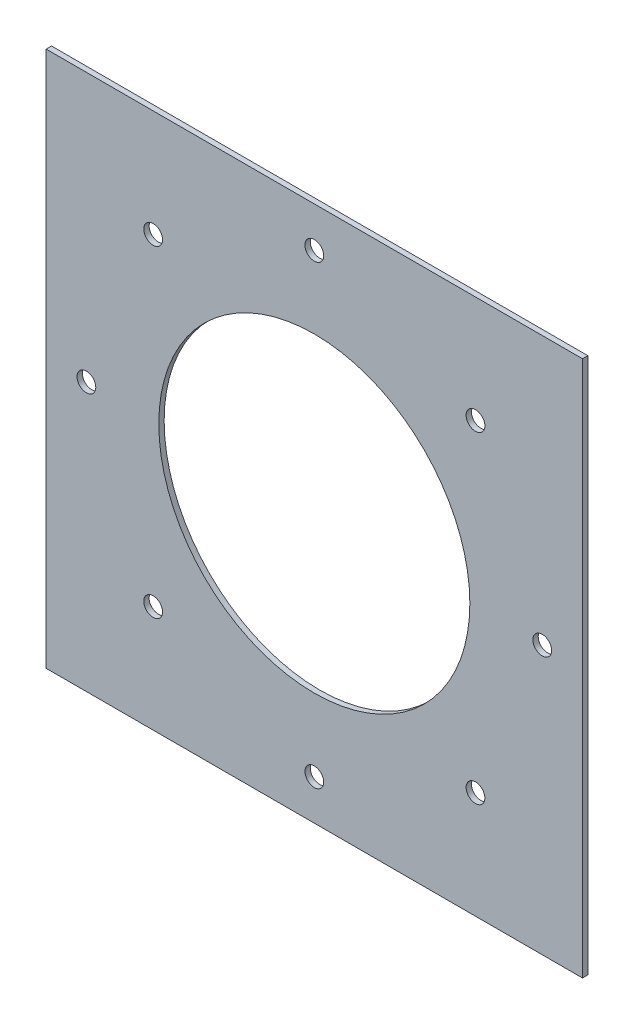
ISO-10303-21;
HEADER;
FILE_DESCRIPTION(('STEP AP214'),'2;1');
FILE_NAME('part.step','',(''),(''),'','','');
FILE_SCHEMA(('AUTOMOTIVE_DESIGN { 1 0 10303 214 1 1 1 1 }'));
ENDSEC;
DATA;
#1=APPLICATION_CONTEXT('core data for automotive mechanical design processes');
#2=APPLICATION_PROTOCOL_DEFINITION('international standard','automotive_design',2000,#1);
#3=PRODUCT_CONTEXT('',#1,'mechanical');
#4=PRODUCT('Part','Part','',(#3));
#5=PRODUCT_RELATED_PRODUCT_CATEGORY('part','',(#4));
#6=PRODUCT_DEFINITION_FORMATION('','',#4);
#7=PRODUCT_DEFINITION_CONTEXT('part definition',#1,'design');
#8=PRODUCT_DEFINITION('design','',#6,#7);
#9=PRODUCT_DEFINITION_SHAPE('','',#8);
#10=(LENGTH_UNIT() NAMED_UNIT(*) SI_UNIT(.MILLI.,.METRE.));
#11=(NAMED_UNIT(*) PLANE_ANGLE_UNIT() SI_UNIT($,.RADIAN.));
#12=(NAMED_UNIT(*) SI_UNIT($,.STERADIAN.) SOLID_ANGLE_UNIT());
#13=UNCERTAINTY_MEASURE_WITH_UNIT(LENGTH_MEASURE(1.E-05),#10,'distance_accuracy_value','');
#14=(GEOMETRIC_REPRESENTATION_CONTEXT(3) GLOBAL_UNCERTAINTY_ASSIGNED_CONTEXT((#13)) GLOBAL_UNIT_ASSIGNED_CONTEXT((#10,
#11,#12)) REPRESENTATION_CONTEXT('',''));
#15=CARTESIAN_POINT('',(0.,0.,0.));
#16=DIRECTION('',(0.,0.,1.));
#17=DIRECTION('',(1.,0.,0.));
#18=AXIS2_PLACEMENT_3D('',#15,#16,#17);
#19=CARTESIAN_POINT('',(50.,-50.,1.));
#20=DIRECTION('',(-1.,0.,0.));
#21=DIRECTION('',(0.,0.,1.));
#22=AXIS2_PLACEMENT_3D('',#19,#20,#21);
#23=PLANE('',#22);
#24=DIRECTION('',(0.,1.,0.));
#25=VECTOR('',#24,1.);
#26=CARTESIAN_POINT('',(50.,-50.,0.));
#27=LINE('',#26,#25);
#28=CARTESIAN_POINT('',(50.,-50.,0.));
#29=VERTEX_POINT('',#28);
#30=CARTESIAN_POINT('',(50.,50.,0.));
#31=VERTEX_POINT('',#30);
#32=EDGE_CURVE('E105',#29,#31,#27,.T.);
#33=ORIENTED_EDGE('',*,*,#32,.T.);
#34=DIRECTION('',(0.,0.,-1.));
#35=VECTOR('',#34,1.);
#36=CARTESIAN_POINT('',(50.,50.,1.));
#37=LINE('',#36,#35);
#38=CARTESIAN_POINT('',(50.,50.,1.));
#39=VERTEX_POINT('',#38);
#40=EDGE_CURVE('E11',#39,#31,#37,.T.);
#41=ORIENTED_EDGE('',*,*,#40,.F.);
#42=DIRECTION('',(0.,1.,0.));
#43=VECTOR('',#42,1.);
#44=CARTESIAN_POINT('',(50.,-50.,1.));
#45=LINE('',#44,#43);
#46=CARTESIAN_POINT('',(50.,-50.,1.));
#47=VERTEX_POINT('',#46);
#48=EDGE_CURVE('E92',#47,#39,#45,.T.);
#49=ORIENTED_EDGE('',*,*,#48,.F.);
#50=DIRECTION('',(0.,0.,-1.));
#51=VECTOR('',#50,1.);
#52=CARTESIAN_POINT('',(50.,-50.,1.));
#53=LINE('',#52,#51);
#54=EDGE_CURVE('E101',#47,#29,#53,.T.);
#55=ORIENTED_EDGE('',*,*,#54,.T.);
#56=EDGE_LOOP('',(#33,#41,#49,#55));
#57=FACE_BOUND('',#56,.T.);
#58=ADVANCED_FACE('F39',(#57),#23,.F.);
#59=CARTESIAN_POINT('',(-50.,50.,1.));
#60=DIRECTION('',(0.,-1.,0.));
#61=DIRECTION('',(0.,0.,-1.));
#62=AXIS2_PLACEMENT_3D('',#59,#60,#61);
#63=PLANE('',#62);
#64=DIRECTION('',(-1.,0.,0.));
#65=VECTOR('',#64,1.);
#66=CARTESIAN_POINT('',(-50.,50.,0.));
#67=LINE('',#66,#65);
#68=CARTESIAN_POINT('',(-50.,50.,0.));
#69=VERTEX_POINT('',#68);
#70=EDGE_CURVE('E96',#31,#69,#67,.T.);
#71=ORIENTED_EDGE('',*,*,#70,.T.);
#72=DIRECTION('',(0.,0.,-1.));
#73=VECTOR('',#72,1.);
#74=CARTESIAN_POINT('',(-50.,50.,1.));
#75=LINE('',#74,#73);
#76=CARTESIAN_POINT('',(-50.,50.,1.));
#77=VERTEX_POINT('',#76);
#78=EDGE_CURVE('E48',#77,#69,#75,.T.);
#79=ORIENTED_EDGE('',*,*,#78,.F.);
#80=DIRECTION('',(-1.,0.,0.));
#81=VECTOR('',#80,1.);
#82=CARTESIAN_POINT('',(-50.,50.,1.));
#83=LINE('',#82,#81);
#84=EDGE_CURVE('E87',#39,#77,#83,.T.);
#85=ORIENTED_EDGE('',*,*,#84,.F.);
#86=ORIENTED_EDGE('',*,*,#40,.T.);
#87=EDGE_LOOP('',(#71,#79,#85,#86));
#88=FACE_BOUND('',#87,.T.);
#89=ADVANCED_FACE('F95',(#88),#63,.F.);
#90=CARTESIAN_POINT('',(-50.,-50.,1.));
#91=DIRECTION('',(1.,0.,0.));
#92=DIRECTION('',(0.,0.,-1.));
#93=AXIS2_PLACEMENT_3D('',#90,#91,#92);
#94=PLANE('',#93);
#95=DIRECTION('',(0.,-1.,0.));
#96=VECTOR('',#95,1.);
#97=CARTESIAN_POINT('',(-50.,-50.,0.));
#98=LINE('',#97,#96);
#99=CARTESIAN_POINT('',(-50.,-50.,0.));
#100=VERTEX_POINT('',#99);
#101=EDGE_CURVE('E74',#69,#100,#98,.T.);
#102=ORIENTED_EDGE('',*,*,#101,.T.);
#103=DIRECTION('',(0.,0.,-1.));
#104=VECTOR('',#103,1.);
#105=CARTESIAN_POINT('',(-50.,-50.,1.));
#106=LINE('',#105,#104);
#107=CARTESIAN_POINT('',(-50.,-50.,1.));
#108=VERTEX_POINT('',#107);
#109=EDGE_CURVE('E97',#108,#100,#106,.T.);
#110=ORIENTED_EDGE('',*,*,#109,.F.);
#111=DIRECTION('',(0.,-1.,0.));
#112=VECTOR('',#111,1.);
#113=CARTESIAN_POINT('',(-50.,-50.,1.));
#114=LINE('',#113,#112);
#115=EDGE_CURVE('E90',#77,#108,#114,.T.);
#116=ORIENTED_EDGE('',*,*,#115,.F.);
#117=ORIENTED_EDGE('',*,*,#78,.T.);
#118=EDGE_LOOP('',(#102,#110,#116,#117));
#119=FACE_BOUND('',#118,.T.);
#120=ADVANCED_FACE('F99',(#119),#94,.F.);
#121=CARTESIAN_POINT('',(-50.,-50.,1.));
#122=DIRECTION('',(0.,1.,0.));
#123=DIRECTION('',(0.,0.,1.));
#124=AXIS2_PLACEMENT_3D('',#121,#122,#123);
#125=PLANE('',#124);
#126=DIRECTION('',(1.,0.,0.));
#127=VECTOR('',#126,1.);
#128=CARTESIAN_POINT('',(-50.,-50.,0.));
#129=LINE('',#128,#127);
#130=EDGE_CURVE('E80',#100,#29,#129,.T.);
#131=ORIENTED_EDGE('',*,*,#130,.T.);
#132=ORIENTED_EDGE('',*,*,#54,.F.);
#133=DIRECTION('',(1.,0.,0.));
#134=VECTOR('',#133,1.);
#135=CARTESIAN_POINT('',(-50.,-50.,1.));
#136=LINE('',#135,#134);
#137=EDGE_CURVE('E57',#108,#47,#136,.T.);
#138=ORIENTED_EDGE('',*,*,#137,.F.);
#139=ORIENTED_EDGE('',*,*,#109,.T.);
#140=EDGE_LOOP('',(#131,#132,#138,#139));
#141=FACE_BOUND('',#140,.T.);
#142=ADVANCED_FACE('F163',(#141),#125,.F.);
#143=CARTESIAN_POINT('',(0.,0.,1.));
#144=DIRECTION('',(0.,0.,-1.));
#145=DIRECTION('',(-1.,0.,0.));
#146=AXIS2_PLACEMENT_3D('',#143,#144,#145);
#147=PLANE('',#146);
#148=CARTESIAN_POINT('',(0.,0.,1.));
#149=DIRECTION('',(0.,0.,1.));
#150=DIRECTION('',(1.,0.,0.));
#151=AXIS2_PLACEMENT_3D('',#148,#149,#150);
#152=CIRCLE('',#151,29.);
#153=CARTESIAN_POINT('',(29.,0.,1.));
#154=VERTEX_POINT('',#153);
#155=EDGE_CURVE('E296',#154,#154,#152,.T.);
#156=ORIENTED_EDGE('',*,*,#155,.F.);
#157=EDGE_LOOP('',(#156));
#158=FACE_BOUND('',#157,.T.);
#159=CARTESIAN_POINT('',(-42.5,0.,1.));
#160=DIRECTION('',(0.,0.,1.));
#161=DIRECTION('',(1.,0.,0.));
#162=AXIS2_PLACEMENT_3D('',#159,#160,#161);
#163=CIRCLE('',#162,1.75);
#164=CARTESIAN_POINT('',(-40.75,0.,1.));
#165=VERTEX_POINT('',#164);
#166=EDGE_CURVE('E118',#165,#165,#163,.T.);
#167=ORIENTED_EDGE('',*,*,#166,.F.);
#168=EDGE_LOOP('',(#167));
#169=FACE_BOUND('',#168,.T.);
#170=CARTESIAN_POINT('',(-30.0520382004282,30.0520382004283,1.));
#171=DIRECTION('',(0.,0.,1.));
#172=DIRECTION('',(1.,0.,0.));
#173=AXIS2_PLACEMENT_3D('',#170,#171,#172);
#174=CIRCLE('',#173,1.75);
#175=CARTESIAN_POINT('',(-28.3020382004282,30.0520382004283,1.));
#176=VERTEX_POINT('',#175);
#177=EDGE_CURVE('E302',#176,#176,#174,.T.);
#178=ORIENTED_EDGE('',*,*,#177,.F.);
#179=EDGE_LOOP('',(#178));
#180=FACE_BOUND('',#179,.T.);
#181=CARTESIAN_POINT('',(1.48387956900833E-13,42.5,1.));
#182=DIRECTION('',(0.,0.,1.));
#183=DIRECTION('',(1.,0.,0.));
#184=AXIS2_PLACEMENT_3D('',#181,#182,#183);
#185=CIRCLE('',#184,1.75);
#186=CARTESIAN_POINT('',(1.75000000000015,42.5,1.));
#187=VERTEX_POINT('',#186);
#188=EDGE_CURVE('E305',#187,#187,#185,.T.);
#189=ORIENTED_EDGE('',*,*,#188,.F.);
#190=EDGE_LOOP('',(#189));
#191=FACE_BOUND('',#190,.T.);
#192=CARTESIAN_POINT('',(30.0520382004284,30.0520382004281,1.));
#193=DIRECTION('',(0.,0.,1.));
#194=DIRECTION('',(1.,0.,0.));
#195=AXIS2_PLACEMENT_3D('',#192,#193,#194);
#196=CIRCLE('',#195,1.75);
#197=CARTESIAN_POINT('',(31.8020382004284,30.0520382004281,1.));
#198=VERTEX_POINT('',#197);
#199=EDGE_CURVE('E308',#198,#198,#196,.T.);
#200=ORIENTED_EDGE('',*,*,#199,.F.);
#201=EDGE_LOOP('',(#200));
#202=FACE_BOUND('',#201,.T.);
#203=CARTESIAN_POINT('',(42.5,-2.96775913801666E-13,1.));
#204=DIRECTION('',(0.,0.,1.));
#205=DIRECTION('',(1.,0.,0.));
#206=AXIS2_PLACEMENT_3D('',#203,#204,#205);
#207=CIRCLE('',#206,1.75000000000001);
#208=CARTESIAN_POINT('',(44.25,-2.96775913801666E-13,1.));
#209=VERTEX_POINT('',#208);
#210=EDGE_CURVE('E311',#209,#209,#207,.T.);
#211=ORIENTED_EDGE('',*,*,#210,.F.);
#212=EDGE_LOOP('',(#211));
#213=FACE_BOUND('',#212,.T.);
#214=CARTESIAN_POINT('',(30.052038200428,-30.0520382004285,1.));
#215=DIRECTION('',(0.,0.,1.));
#216=DIRECTION('',(1.,0.,0.));
#217=AXIS2_PLACEMENT_3D('',#214,#215,#216);
#218=CIRCLE('',#217,1.75);
#219=CARTESIAN_POINT('',(31.802038200428,-30.0520382004285,1.));
#220=VERTEX_POINT('',#219);
#221=EDGE_CURVE('E314',#220,#220,#218,.T.);
#222=ORIENTED_EDGE('',*,*,#221,.F.);
#223=EDGE_LOOP('',(#222));
#224=FACE_BOUND('',#223,.T.);
#225=CARTESIAN_POINT('',(-4.451638707025E-13,-42.5,1.));
#226=DIRECTION('',(0.,0.,1.));
#227=DIRECTION('',(1.,0.,0.));
#228=AXIS2_PLACEMENT_3D('',#225,#226,#227);
#229=CIRCLE('',#228,1.75000000000001);
#230=CARTESIAN_POINT('',(1.74999999999956,-42.5,1.));
#231=VERTEX_POINT('',#230);
#232=EDGE_CURVE('E317',#231,#231,#229,.T.);
#233=ORIENTED_EDGE('',*,*,#232,.F.);
#234=EDGE_LOOP('',(#233));
#235=FACE_BOUND('',#234,.T.);
#236=CARTESIAN_POINT('',(-30.0520382004286,-30.0520382004279,1.));
#237=DIRECTION('',(0.,0.,1.));
#238=DIRECTION('',(1.,0.,0.));
#239=AXIS2_PLACEMENT_3D('',#236,#237,#238);
#240=CIRCLE('',#239,1.75);
#241=CARTESIAN_POINT('',(-28.3020382004286,-30.0520382004279,1.));
#242=VERTEX_POINT('',#241);
#243=EDGE_CURVE('E298',#242,#242,#240,.T.);
#244=ORIENTED_EDGE('',*,*,#243,.F.);
#245=EDGE_LOOP('',(#244));
#246=FACE_BOUND('',#245,.T.);
#247=ORIENTED_EDGE('',*,*,#48,.T.);
#248=ORIENTED_EDGE('',*,*,#84,.T.);
#249=ORIENTED_EDGE('',*,*,#115,.T.);
#250=ORIENTED_EDGE('',*,*,#137,.T.);
#251=EDGE_LOOP('',(#247,#248,#249,#250));
#252=FACE_BOUND('',#251,.T.);
#253=ADVANCED_FACE('F88',(#158,#169,#180,#191,#202,#213,#224,#235,#246,#252),#147,.F.);
#254=CARTESIAN_POINT('',(0.,0.,0.));
#255=DIRECTION('',(0.,0.,-1.));
#256=DIRECTION('',(-1.,0.,0.));
#257=AXIS2_PLACEMENT_3D('',#254,#255,#256);
#258=PLANE('',#257);
#259=CARTESIAN_POINT('',(0.,0.,0.));
#260=DIRECTION('',(0.,0.,-1.));
#261=DIRECTION('',(-1.,0.,0.));
#262=AXIS2_PLACEMENT_3D('',#259,#260,#261);
#263=CIRCLE('',#262,29.);
#264=CARTESIAN_POINT('',(-29.,0.,0.));
#265=VERTEX_POINT('',#264);
#266=EDGE_CURVE('E42',#265,#265,#263,.T.);
#267=ORIENTED_EDGE('',*,*,#266,.F.);
#268=EDGE_LOOP('',(#267));
#269=FACE_BOUND('',#268,.T.);
#270=CARTESIAN_POINT('',(-42.5,0.,0.));
#271=DIRECTION('',(0.,0.,-1.));
#272=DIRECTION('',(-1.,0.,0.));
#273=AXIS2_PLACEMENT_3D('',#270,#271,#272);
#274=CIRCLE('',#273,1.75);
#275=CARTESIAN_POINT('',(-44.25,0.,0.));
#276=VERTEX_POINT('',#275);
#277=EDGE_CURVE('E108',#276,#276,#274,.T.);
#278=ORIENTED_EDGE('',*,*,#277,.F.);
#279=EDGE_LOOP('',(#278));
#280=FACE_BOUND('',#279,.T.);
#281=CARTESIAN_POINT('',(-30.0520382004282,30.0520382004283,0.));
#282=DIRECTION('',(0.,0.,-1.));
#283=DIRECTION('',(-1.,0.,0.));
#284=AXIS2_PLACEMENT_3D('',#281,#282,#283);
#285=CIRCLE('',#284,1.75);
#286=CARTESIAN_POINT('',(-31.8020382004282,30.0520382004283,0.));
#287=VERTEX_POINT('',#286);
#288=EDGE_CURVE('E133',#287,#287,#285,.T.);
#289=ORIENTED_EDGE('',*,*,#288,.F.);
#290=EDGE_LOOP('',(#289));
#291=FACE_BOUND('',#290,.T.);
#292=CARTESIAN_POINT('',(1.48387956900833E-13,42.5,0.));
#293=DIRECTION('',(0.,0.,-1.));
#294=DIRECTION('',(-1.,0.,0.));
#295=AXIS2_PLACEMENT_3D('',#292,#293,#294);
#296=CIRCLE('',#295,1.75);
#297=CARTESIAN_POINT('',(-1.74999999999985,42.5,0.));
#298=VERTEX_POINT('',#297);
#299=EDGE_CURVE('E130',#298,#298,#296,.T.);
#300=ORIENTED_EDGE('',*,*,#299,.F.);
#301=EDGE_LOOP('',(#300));
#302=FACE_BOUND('',#301,.T.);
#303=CARTESIAN_POINT('',(30.0520382004284,30.0520382004281,0.));
#304=DIRECTION('',(0.,0.,-1.));
#305=DIRECTION('',(-1.,0.,0.));
#306=AXIS2_PLACEMENT_3D('',#303,#304,#305);
#307=CIRCLE('',#306,1.75);
#308=CARTESIAN_POINT('',(28.3020382004284,30.0520382004281,0.));
#309=VERTEX_POINT('',#308);
#310=EDGE_CURVE('E127',#309,#309,#307,.T.);
#311=ORIENTED_EDGE('',*,*,#310,.F.);
#312=EDGE_LOOP('',(#311));
#313=FACE_BOUND('',#312,.T.);
#314=CARTESIAN_POINT('',(42.5,-2.96775913801666E-13,0.));
#315=DIRECTION('',(0.,0.,-1.));
#316=DIRECTION('',(-1.,0.,0.));
#317=AXIS2_PLACEMENT_3D('',#314,#315,#316);
#318=CIRCLE('',#317,1.75000000000001);
#319=CARTESIAN_POINT('',(40.75,-2.96775913801666E-13,0.));
#320=VERTEX_POINT('',#319);
#321=EDGE_CURVE('E124',#320,#320,#318,.T.);
#322=ORIENTED_EDGE('',*,*,#321,.F.);
#323=EDGE_LOOP('',(#322));
#324=FACE_BOUND('',#323,.T.);
#325=CARTESIAN_POINT('',(30.052038200428,-30.0520382004285,0.));
#326=DIRECTION('',(0.,0.,-1.));
#327=DIRECTION('',(-1.,0.,0.));
#328=AXIS2_PLACEMENT_3D('',#325,#326,#327);
#329=CIRCLE('',#328,1.75);
#330=CARTESIAN_POINT('',(28.302038200428,-30.0520382004285,0.));
#331=VERTEX_POINT('',#330);
#332=EDGE_CURVE('E121',#331,#331,#329,.T.);
#333=ORIENTED_EDGE('',*,*,#332,.F.);
#334=EDGE_LOOP('',(#333));
#335=FACE_BOUND('',#334,.T.);
#336=CARTESIAN_POINT('',(-4.451638707025E-13,-42.5,0.));
#337=DIRECTION('',(0.,0.,-1.));
#338=DIRECTION('',(-1.,0.,0.));
#339=AXIS2_PLACEMENT_3D('',#336,#337,#338);
#340=CIRCLE('',#339,1.75000000000001);
#341=CARTESIAN_POINT('',(-1.75000000000045,-42.5,0.));
#342=VERTEX_POINT('',#341);
#343=EDGE_CURVE('E117',#342,#342,#340,.T.);
#344=ORIENTED_EDGE('',*,*,#343,.F.);
#345=EDGE_LOOP('',(#344));
#346=FACE_BOUND('',#345,.T.);
#347=CARTESIAN_POINT('',(-30.0520382004286,-30.0520382004279,0.));
#348=DIRECTION('',(0.,0.,-1.));
#349=DIRECTION('',(-1.,0.,0.));
#350=AXIS2_PLACEMENT_3D('',#347,#348,#349);
#351=CIRCLE('',#350,1.75);
#352=CARTESIAN_POINT('',(-31.8020382004286,-30.0520382004279,0.));
#353=VERTEX_POINT('',#352);
#354=EDGE_CURVE('E114',#353,#353,#351,.T.);
#355=ORIENTED_EDGE('',*,*,#354,.F.);
#356=EDGE_LOOP('',(#355));
#357=FACE_BOUND('',#356,.T.);
#358=ORIENTED_EDGE('',*,*,#32,.F.);
#359=ORIENTED_EDGE('',*,*,#130,.F.);
#360=ORIENTED_EDGE('',*,*,#101,.F.);
#361=ORIENTED_EDGE('',*,*,#70,.F.);
#362=EDGE_LOOP('',(#358,#359,#360,#361));
#363=FACE_BOUND('',#362,.T.);
#364=ADVANCED_FACE('F141',(#269,#280,#291,#302,#313,#324,#335,#346,#357,#363),#258,.T.);
#365=CARTESIAN_POINT('',(-30.0520382004286,-30.0520382004279,-3.));
#366=DIRECTION('',(0.,0.,1.));
#367=DIRECTION('',(1.,0.,0.));
#368=AXIS2_PLACEMENT_3D('',#365,#366,#367);
#369=CYLINDRICAL_SURFACE('',#368,1.75);
#370=ORIENTED_EDGE('',*,*,#354,.T.);
#371=EDGE_LOOP('',(#370));
#372=FACE_BOUND('',#371,.T.);
#373=ORIENTED_EDGE('',*,*,#243,.T.);
#374=EDGE_LOOP('',(#373));
#375=FACE_BOUND('',#374,.T.);
#376=ADVANCED_FACE('F144',(#372,#375),#369,.F.);
#377=CARTESIAN_POINT('',(-4.451638707025E-13,-42.5,-3.));
#378=DIRECTION('',(0.,0.,1.));
#379=DIRECTION('',(1.,0.,0.));
#380=AXIS2_PLACEMENT_3D('',#377,#378,#379);
#381=CYLINDRICAL_SURFACE('',#380,1.75000000000001);
#382=ORIENTED_EDGE('',*,*,#343,.T.);
#383=EDGE_LOOP('',(#382));
#384=FACE_BOUND('',#383,.T.);
#385=ORIENTED_EDGE('',*,*,#232,.T.);
#386=EDGE_LOOP('',(#385));
#387=FACE_BOUND('',#386,.T.);
#388=ADVANCED_FACE('F212',(#384,#387),#381,.F.);
#389=CARTESIAN_POINT('',(30.052038200428,-30.0520382004285,-3.));
#390=DIRECTION('',(0.,0.,1.));
#391=DIRECTION('',(1.,0.,0.));
#392=AXIS2_PLACEMENT_3D('',#389,#390,#391);
#393=CYLINDRICAL_SURFACE('',#392,1.75);
#394=ORIENTED_EDGE('',*,*,#332,.T.);
#395=EDGE_LOOP('',(#394));
#396=FACE_BOUND('',#395,.T.);
#397=ORIENTED_EDGE('',*,*,#221,.T.);
#398=EDGE_LOOP('',(#397));
#399=FACE_BOUND('',#398,.T.);
#400=ADVANCED_FACE('F222',(#396,#399),#393,.F.);
#401=CARTESIAN_POINT('',(42.5,-2.96775913801666E-13,-3.));
#402=DIRECTION('',(0.,0.,1.));
#403=DIRECTION('',(1.,0.,0.));
#404=AXIS2_PLACEMENT_3D('',#401,#402,#403);
#405=CYLINDRICAL_SURFACE('',#404,1.75000000000001);
#406=ORIENTED_EDGE('',*,*,#321,.T.);
#407=EDGE_LOOP('',(#406));
#408=FACE_BOUND('',#407,.T.);
#409=ORIENTED_EDGE('',*,*,#210,.T.);
#410=EDGE_LOOP('',(#409));
#411=FACE_BOUND('',#410,.T.);
#412=ADVANCED_FACE('F232',(#408,#411),#405,.F.);
#413=CARTESIAN_POINT('',(30.0520382004284,30.0520382004281,-3.));
#414=DIRECTION('',(0.,0.,1.));
#415=DIRECTION('',(1.,0.,0.));
#416=AXIS2_PLACEMENT_3D('',#413,#414,#415);
#417=CYLINDRICAL_SURFACE('',#416,1.75);
#418=ORIENTED_EDGE('',*,*,#310,.T.);
#419=EDGE_LOOP('',(#418));
#420=FACE_BOUND('',#419,.T.);
#421=ORIENTED_EDGE('',*,*,#199,.T.);
#422=EDGE_LOOP('',(#421));
#423=FACE_BOUND('',#422,.T.);
#424=ADVANCED_FACE('F242',(#420,#423),#417,.F.);
#425=CARTESIAN_POINT('',(1.48387956900833E-13,42.5,-3.));
#426=DIRECTION('',(0.,0.,1.));
#427=DIRECTION('',(1.,0.,0.));
#428=AXIS2_PLACEMENT_3D('',#425,#426,#427);
#429=CYLINDRICAL_SURFACE('',#428,1.75);
#430=ORIENTED_EDGE('',*,*,#299,.T.);
#431=EDGE_LOOP('',(#430));
#432=FACE_BOUND('',#431,.T.);
#433=ORIENTED_EDGE('',*,*,#188,.T.);
#434=EDGE_LOOP('',(#433));
#435=FACE_BOUND('',#434,.T.);
#436=ADVANCED_FACE('F252',(#432,#435),#429,.F.);
#437=CARTESIAN_POINT('',(-30.0520382004282,30.0520382004283,-3.));
#438=DIRECTION('',(0.,0.,1.));
#439=DIRECTION('',(1.,0.,0.));
#440=AXIS2_PLACEMENT_3D('',#437,#438,#439);
#441=CYLINDRICAL_SURFACE('',#440,1.75);
#442=ORIENTED_EDGE('',*,*,#288,.T.);
#443=EDGE_LOOP('',(#442));
#444=FACE_BOUND('',#443,.T.);
#445=ORIENTED_EDGE('',*,*,#177,.T.);
#446=EDGE_LOOP('',(#445));
#447=FACE_BOUND('',#446,.T.);
#448=ADVANCED_FACE('F262',(#444,#447),#441,.F.);
#449=CARTESIAN_POINT('',(-42.5,0.,-3.));
#450=DIRECTION('',(0.,0.,1.));
#451=DIRECTION('',(1.,0.,0.));
#452=AXIS2_PLACEMENT_3D('',#449,#450,#451);
#453=CYLINDRICAL_SURFACE('',#452,1.75);
#454=ORIENTED_EDGE('',*,*,#277,.T.);
#455=EDGE_LOOP('',(#454));
#456=FACE_BOUND('',#455,.T.);
#457=ORIENTED_EDGE('',*,*,#166,.T.);
#458=EDGE_LOOP('',(#457));
#459=FACE_BOUND('',#458,.T.);
#460=ADVANCED_FACE('F138',(#456,#459),#453,.F.);
#461=CARTESIAN_POINT('',(0.,0.,-3.));
#462=DIRECTION('',(0.,0.,1.));
#463=DIRECTION('',(1.,0.,0.));
#464=AXIS2_PLACEMENT_3D('',#461,#462,#463);
#465=CYLINDRICAL_SURFACE('',#464,29.);
#466=ORIENTED_EDGE('',*,*,#266,.T.);
#467=EDGE_LOOP('',(#466));
#468=FACE_BOUND('',#467,.T.);
#469=ORIENTED_EDGE('',*,*,#155,.T.);
#470=EDGE_LOOP('',(#469));
#471=FACE_BOUND('',#470,.T.);
#472=ADVANCED_FACE('F280',(#468,#471),#465,.F.);
#473=CLOSED_SHELL('',(#58,#89,#120,#142,#253,#364,#376,#388,#400,#412,#424,#436,#448,#460,#472));
#474=MANIFOLD_SOLID_BREP('B2',#473);
#475=ADVANCED_BREP_SHAPE_REPRESENTATION('',(#18,#474),#14);
#476=SHAPE_DEFINITION_REPRESENTATION(#9,#475);
ENDSEC;
END-ISO-10303-21;
